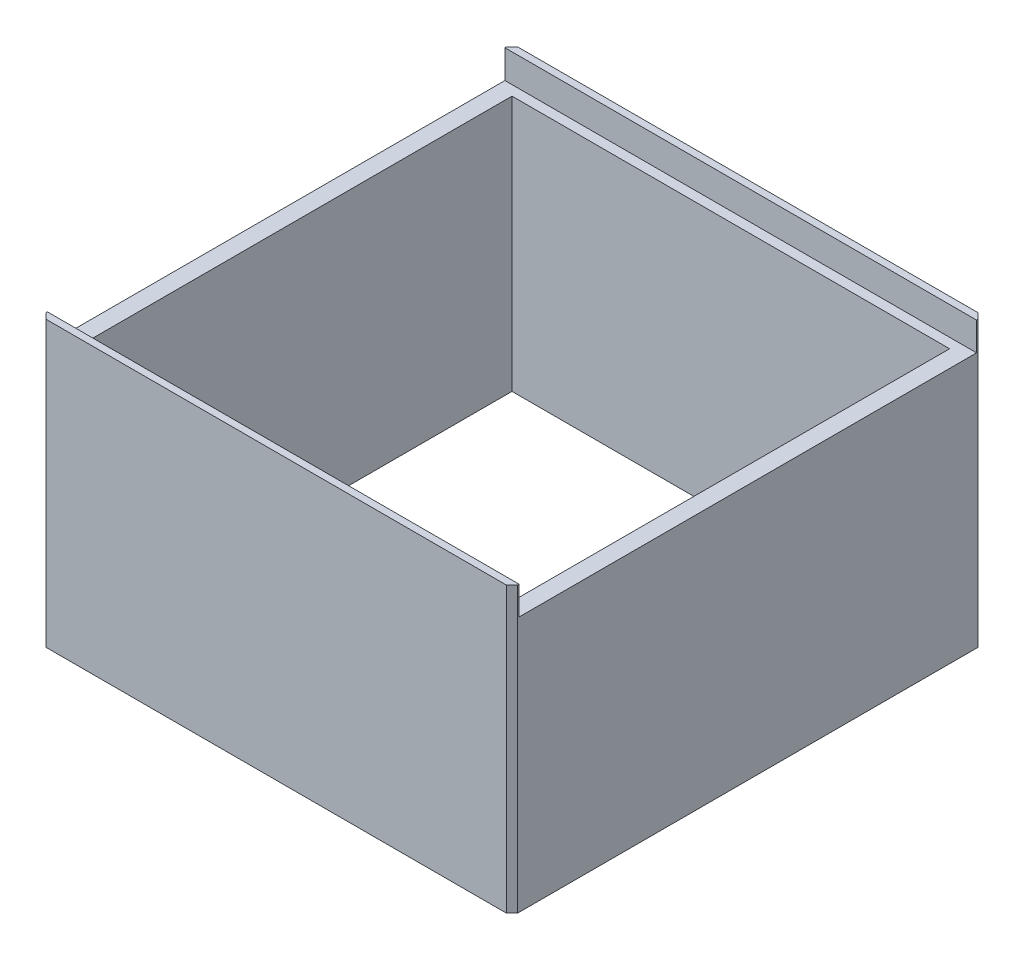
ISO-10303-21;
HEADER;
FILE_DESCRIPTION(('STEP AP214'),'2;1');
FILE_NAME('part.step','',(''),(''),'','','');
FILE_SCHEMA(('AUTOMOTIVE_DESIGN { 1 0 10303 214 1 1 1 1 }'));
ENDSEC;
DATA;
#1=APPLICATION_CONTEXT('core data for automotive mechanical design processes');
#2=APPLICATION_PROTOCOL_DEFINITION('international standard','automotive_design',2000,#1);
#3=PRODUCT_CONTEXT('',#1,'mechanical');
#4=PRODUCT('Part','Part','',(#3));
#5=PRODUCT_RELATED_PRODUCT_CATEGORY('part','',(#4));
#6=PRODUCT_DEFINITION_FORMATION('','',#4);
#7=PRODUCT_DEFINITION_CONTEXT('part definition',#1,'design');
#8=PRODUCT_DEFINITION('design','',#6,#7);
#9=PRODUCT_DEFINITION_SHAPE('','',#8);
#10=(LENGTH_UNIT() NAMED_UNIT(*) SI_UNIT(.MILLI.,.METRE.));
#11=(NAMED_UNIT(*) PLANE_ANGLE_UNIT() SI_UNIT($,.RADIAN.));
#12=(NAMED_UNIT(*) SI_UNIT($,.STERADIAN.) SOLID_ANGLE_UNIT());
#13=UNCERTAINTY_MEASURE_WITH_UNIT(LENGTH_MEASURE(1.E-05),#10,'distance_accuracy_value','');
#14=(GEOMETRIC_REPRESENTATION_CONTEXT(3) GLOBAL_UNCERTAINTY_ASSIGNED_CONTEXT((#13)) GLOBAL_UNIT_ASSIGNED_CONTEXT((#10,
#11,#12)) REPRESENTATION_CONTEXT('',''));
#15=CARTESIAN_POINT('',(0.,0.,0.));
#16=DIRECTION('',(0.,0.,1.));
#17=DIRECTION('',(1.,0.,0.));
#18=AXIS2_PLACEMENT_3D('',#15,#16,#17);
#19=CARTESIAN_POINT('',(38.5,50.,-38.5));
#20=DIRECTION('',(1.,0.,0.));
#21=DIRECTION('',(0.,0.,-1.));
#22=AXIS2_PLACEMENT_3D('',#19,#20,#21);
#23=PLANE('',#22);
#24=DIRECTION('',(0.,0.,1.));
#25=VECTOR('',#24,1.);
#26=CARTESIAN_POINT('',(38.5,4.,-38.5));
#27=LINE('',#26,#25);
#28=CARTESIAN_POINT('',(38.5,4.,-38.5));
#29=VERTEX_POINT('',#28);
#30=CARTESIAN_POINT('',(38.5,4.,-30.5));
#31=VERTEX_POINT('',#30);
#32=EDGE_CURVE('E218',#29,#31,#27,.T.);
#33=ORIENTED_EDGE('',*,*,#32,.T.);
#34=DIRECTION('',(0.,-1.,0.));
#35=VECTOR('',#34,1.);
#36=CARTESIAN_POINT('',(38.5,4.,-30.5));
#37=LINE('',#36,#35);
#38=CARTESIAN_POINT('',(38.5,1.,-30.5));
#39=VERTEX_POINT('',#38);
#40=EDGE_CURVE('E202',#31,#39,#37,.T.);
#41=ORIENTED_EDGE('',*,*,#40,.T.);
#42=DIRECTION('',(0.,0.,1.));
#43=VECTOR('',#42,1.);
#44=CARTESIAN_POINT('',(38.5,1.,-38.5));
#45=LINE('',#44,#43);
#46=CARTESIAN_POINT('',(38.5,1.,-38.5));
#47=VERTEX_POINT('',#46);
#48=EDGE_CURVE('E232',#47,#39,#45,.T.);
#49=ORIENTED_EDGE('',*,*,#48,.F.);
#50=DIRECTION('',(0.,-1.,0.));
#51=VECTOR('',#50,1.);
#52=CARTESIAN_POINT('',(38.5,50.,-38.5));
#53=LINE('',#52,#51);
#54=CARTESIAN_POINT('',(38.5,0.,-38.5));
#55=VERTEX_POINT('',#54);
#56=EDGE_CURVE('E282',#47,#55,#53,.T.);
#57=ORIENTED_EDGE('',*,*,#56,.T.);
#58=DIRECTION('',(0.,0.,1.));
#59=VECTOR('',#58,1.);
#60=CARTESIAN_POINT('',(38.5,0.,-38.5));
#61=LINE('',#60,#59);
#62=CARTESIAN_POINT('',(38.5,0.,38.5));
#63=VERTEX_POINT('',#62);
#64=EDGE_CURVE('E274',#55,#63,#61,.T.);
#65=ORIENTED_EDGE('',*,*,#64,.T.);
#66=DIRECTION('',(0.,-1.,0.));
#67=VECTOR('',#66,1.);
#68=CARTESIAN_POINT('',(38.5,50.,38.5));
#69=LINE('',#68,#67);
#70=CARTESIAN_POINT('',(38.5,45.,38.5));
#71=VERTEX_POINT('',#70);
#72=EDGE_CURVE('E284',#71,#63,#69,.T.);
#73=ORIENTED_EDGE('',*,*,#72,.F.);
#74=DIRECTION('',(0.,0.,1.));
#75=VECTOR('',#74,1.);
#76=CARTESIAN_POINT('',(38.5,45.,-38.5));
#77=LINE('',#76,#75);
#78=CARTESIAN_POINT('',(38.5,45.,-38.5));
#79=VERTEX_POINT('',#78);
#80=EDGE_CURVE('E246',#79,#71,#77,.T.);
#81=ORIENTED_EDGE('',*,*,#80,.F.);
#82=EDGE_CURVE('E225',#79,#29,#53,.T.);
#83=ORIENTED_EDGE('',*,*,#82,.T.);
#84=EDGE_LOOP('',(#33,#41,#49,#57,#65,#73,#81,#83));
#85=FACE_BOUND('',#84,.T.);
#86=ADVANCED_FACE('F63',(#85),#23,.F.);
#87=CARTESIAN_POINT('',(-38.5,50.,-38.5));
#88=DIRECTION('',(0.,0.,-1.));
#89=DIRECTION('',(-1.,0.,0.));
#90=AXIS2_PLACEMENT_3D('',#87,#88,#89);
#91=PLANE('',#90);
#92=DIRECTION('',(1.,0.,0.));
#93=VECTOR('',#92,1.);
#94=CARTESIAN_POINT('',(38.5,4.,-38.5));
#95=LINE('',#94,#93);
#96=CARTESIAN_POINT('',(30.5,4.,-38.5));
#97=VERTEX_POINT('',#96);
#98=EDGE_CURVE('E212',#97,#29,#95,.T.);
#99=ORIENTED_EDGE('',*,*,#98,.T.);
#100=ORIENTED_EDGE('',*,*,#82,.F.);
#101=DIRECTION('',(1.,0.,0.));
#102=VECTOR('',#101,1.);
#103=CARTESIAN_POINT('',(-38.5,45.,-38.5));
#104=LINE('',#103,#102);
#105=CARTESIAN_POINT('',(-38.5,45.,-38.5));
#106=VERTEX_POINT('',#105);
#107=EDGE_CURVE('E301',#106,#79,#104,.T.);
#108=ORIENTED_EDGE('',*,*,#107,.F.);
#109=DIRECTION('',(0.,-1.,0.));
#110=VECTOR('',#109,1.);
#111=CARTESIAN_POINT('',(-38.5,50.,-38.5));
#112=LINE('',#111,#110);
#113=CARTESIAN_POINT('',(-38.5,0.,-38.5));
#114=VERTEX_POINT('',#113);
#115=EDGE_CURVE('E280',#106,#114,#112,.T.);
#116=ORIENTED_EDGE('',*,*,#115,.T.);
#117=DIRECTION('',(1.,0.,0.));
#118=VECTOR('',#117,1.);
#119=CARTESIAN_POINT('',(-38.5,0.,-38.5));
#120=LINE('',#119,#118);
#121=EDGE_CURVE('E277',#114,#55,#120,.T.);
#122=ORIENTED_EDGE('',*,*,#121,.T.);
#123=ORIENTED_EDGE('',*,*,#56,.F.);
#124=DIRECTION('',(1.,0.,0.));
#125=VECTOR('',#124,1.);
#126=CARTESIAN_POINT('',(38.5,1.,-38.5));
#127=LINE('',#126,#125);
#128=CARTESIAN_POINT('',(30.5,1.,-38.5));
#129=VERTEX_POINT('',#128);
#130=EDGE_CURVE('E226',#129,#47,#127,.T.);
#131=ORIENTED_EDGE('',*,*,#130,.F.);
#132=DIRECTION('',(0.,-1.,0.));
#133=VECTOR('',#132,1.);
#134=CARTESIAN_POINT('',(30.5,4.,-38.5));
#135=LINE('',#134,#133);
#136=EDGE_CURVE('E236',#97,#129,#135,.T.);
#137=ORIENTED_EDGE('',*,*,#136,.F.);
#138=EDGE_LOOP('',(#99,#100,#108,#116,#122,#123,#131,#137));
#139=FACE_BOUND('',#138,.T.);
#140=ADVANCED_FACE('F402',(#139),#91,.F.);
#141=CARTESIAN_POINT('',(0.,50.,0.));
#142=DIRECTION('',(0.,1.,0.));
#143=DIRECTION('',(0.,0.,1.));
#144=AXIS2_PLACEMENT_3D('',#141,#142,#143);
#145=PLANE('',#144);
#146=DIRECTION('',(1.,0.,0.));
#147=VECTOR('',#146,1.);
#148=CARTESIAN_POINT('',(-41.5,50.,41.5));
#149=LINE('',#148,#147);
#150=CARTESIAN_POINT('',(-40.5,50.,41.5));
#151=VERTEX_POINT('',#150);
#152=CARTESIAN_POINT('',(40.5,50.,41.5));
#153=VERTEX_POINT('',#152);
#154=EDGE_CURVE('E291',#151,#153,#149,.T.);
#155=ORIENTED_EDGE('',*,*,#154,.T.);
#156=DIRECTION('',(0.70710678118655,0.,-0.707106781186545));
#157=VECTOR('',#156,1.);
#158=CARTESIAN_POINT('',(40.9999999999999,50.,41.0000000000002));
#159=LINE('',#158,#157);
#160=CARTESIAN_POINT('',(41.5,50.,40.5));
#161=VERTEX_POINT('',#160);
#162=EDGE_CURVE('E348',#153,#161,#159,.T.);
#163=ORIENTED_EDGE('',*,*,#162,.T.);
#164=DIRECTION('',(0.,0.,1.));
#165=VECTOR('',#164,1.);
#166=CARTESIAN_POINT('',(41.5,50.,-41.5));
#167=LINE('',#166,#165);
#168=CARTESIAN_POINT('',(41.5,50.,40.25));
#169=VERTEX_POINT('',#168);
#170=EDGE_CURVE('E295',#169,#161,#167,.T.);
#171=ORIENTED_EDGE('',*,*,#170,.F.);
#172=DIRECTION('',(1.,0.,0.));
#173=VECTOR('',#172,1.);
#174=CARTESIAN_POINT('',(-50.25,50.,40.25));
#175=LINE('',#174,#173);
#176=CARTESIAN_POINT('',(-41.5,50.,40.25));
#177=VERTEX_POINT('',#176);
#178=EDGE_CURVE('E244',#177,#169,#175,.T.);
#179=ORIENTED_EDGE('',*,*,#178,.F.);
#180=DIRECTION('',(0.,0.,1.));
#181=VECTOR('',#180,1.);
#182=CARTESIAN_POINT('',(-41.5,50.,-41.5));
#183=LINE('',#182,#181);
#184=CARTESIAN_POINT('',(-41.5,50.,40.5));
#185=VERTEX_POINT('',#184);
#186=EDGE_CURVE('E292',#177,#185,#183,.T.);
#187=ORIENTED_EDGE('',*,*,#186,.T.);
#188=DIRECTION('',(-0.707106781186543,0.,-0.707106781186552));
#189=VECTOR('',#188,1.);
#190=CARTESIAN_POINT('',(-41.0000000000003,50.,40.9999999999997));
#191=LINE('',#190,#189);
#192=EDGE_CURVE('E346',#185,#151,#191,.F.);
#193=ORIENTED_EDGE('',*,*,#192,.T.);
#194=EDGE_LOOP('',(#155,#163,#171,#179,#187,#193));
#195=FACE_BOUND('',#194,.T.);
#196=ADVANCED_FACE('F371',(#195),#145,.T.);
#197=CARTESIAN_POINT('',(-38.5,50.,-38.5));
#198=DIRECTION('',(1.,0.,0.));
#199=DIRECTION('',(0.,0.,-1.));
#200=AXIS2_PLACEMENT_3D('',#197,#198,#199);
#201=PLANE('',#200);
#202=ORIENTED_EDGE('',*,*,#115,.F.);
#203=DIRECTION('',(0.,0.,1.));
#204=VECTOR('',#203,1.);
#205=CARTESIAN_POINT('',(-38.5,45.,-38.5));
#206=LINE('',#205,#204);
#207=CARTESIAN_POINT('',(-38.5,45.,38.5));
#208=VERTEX_POINT('',#207);
#209=EDGE_CURVE('E254',#106,#208,#206,.T.);
#210=ORIENTED_EDGE('',*,*,#209,.T.);
#211=DIRECTION('',(0.,-1.,0.));
#212=VECTOR('',#211,1.);
#213=CARTESIAN_POINT('',(-38.5,50.,38.5));
#214=LINE('',#213,#212);
#215=CARTESIAN_POINT('',(-38.5,0.,38.5));
#216=VERTEX_POINT('',#215);
#217=EDGE_CURVE('E286',#208,#216,#214,.T.);
#218=ORIENTED_EDGE('',*,*,#217,.T.);
#219=DIRECTION('',(0.,0.,1.));
#220=VECTOR('',#219,1.);
#221=CARTESIAN_POINT('',(-38.5,0.,-38.5));
#222=LINE('',#221,#220);
#223=EDGE_CURVE('E268',#114,#216,#222,.T.);
#224=ORIENTED_EDGE('',*,*,#223,.F.);
#225=EDGE_LOOP('',(#202,#210,#218,#224));
#226=FACE_BOUND('',#225,.T.);
#227=ADVANCED_FACE('F414',(#226),#201,.T.);
#228=CARTESIAN_POINT('',(-38.5,50.,38.5));
#229=DIRECTION('',(0.,0.,-1.));
#230=DIRECTION('',(-1.,0.,0.));
#231=AXIS2_PLACEMENT_3D('',#228,#229,#230);
#232=PLANE('',#231);
#233=ORIENTED_EDGE('',*,*,#217,.F.);
#234=DIRECTION('',(1.,0.,0.));
#235=VECTOR('',#234,1.);
#236=CARTESIAN_POINT('',(-38.5,45.,38.5));
#237=LINE('',#236,#235);
#238=EDGE_CURVE('E251',#208,#71,#237,.T.);
#239=ORIENTED_EDGE('',*,*,#238,.T.);
#240=ORIENTED_EDGE('',*,*,#72,.T.);
#241=DIRECTION('',(1.,0.,0.));
#242=VECTOR('',#241,1.);
#243=CARTESIAN_POINT('',(-38.5,0.,38.5));
#244=LINE('',#243,#242);
#245=EDGE_CURVE('E271',#216,#63,#244,.T.);
#246=ORIENTED_EDGE('',*,*,#245,.F.);
#247=EDGE_LOOP('',(#233,#239,#240,#246));
#248=FACE_BOUND('',#247,.T.);
#249=ADVANCED_FACE('F411',(#248),#232,.T.);
#250=CARTESIAN_POINT('',(41.5,50.,-40.5));
#251=VERTEX_POINT('',#250);
#252=CARTESIAN_POINT('',(41.5,50.,-40.25));
#253=VERTEX_POINT('',#252);
#254=EDGE_CURVE('E296',#251,#253,#167,.T.);
#255=ORIENTED_EDGE('',*,*,#254,.F.);
#256=DIRECTION('',(0.707106781186545,0.,0.70710678118655));
#257=VECTOR('',#256,1.);
#258=CARTESIAN_POINT('',(41.0000000000001,50.,-40.9999999999999));
#259=LINE('',#258,#257);
#260=CARTESIAN_POINT('',(40.5,50.,-41.5));
#261=VERTEX_POINT('',#260);
#262=EDGE_CURVE('E339',#251,#261,#259,.F.);
#263=ORIENTED_EDGE('',*,*,#262,.T.);
#264=DIRECTION('',(1.,0.,0.));
#265=VECTOR('',#264,1.);
#266=CARTESIAN_POINT('',(-41.5,50.,-41.5));
#267=LINE('',#266,#265);
#268=CARTESIAN_POINT('',(-40.5,50.,-41.5));
#269=VERTEX_POINT('',#268);
#270=EDGE_CURVE('E298',#269,#261,#267,.T.);
#271=ORIENTED_EDGE('',*,*,#270,.F.);
#272=DIRECTION('',(-0.707106781186552,0.,0.707106781186543));
#273=VECTOR('',#272,1.);
#274=CARTESIAN_POINT('',(-40.9999999999997,50.,-41.0000000000003));
#275=LINE('',#274,#273);
#276=CARTESIAN_POINT('',(-41.5,50.,-40.5));
#277=VERTEX_POINT('',#276);
#278=EDGE_CURVE('E337',#269,#277,#275,.T.);
#279=ORIENTED_EDGE('',*,*,#278,.T.);
#280=CARTESIAN_POINT('',(-41.5,50.,-40.25));
#281=VERTEX_POINT('',#280);
#282=EDGE_CURVE('E289',#277,#281,#183,.T.);
#283=ORIENTED_EDGE('',*,*,#282,.T.);
#284=DIRECTION('',(-1.,0.,0.));
#285=VECTOR('',#284,1.);
#286=CARTESIAN_POINT('',(-50.25,50.,-40.25));
#287=LINE('',#286,#285);
#288=EDGE_CURVE('E238',#253,#281,#287,.T.);
#289=ORIENTED_EDGE('',*,*,#288,.F.);
#290=EDGE_LOOP('',(#255,#263,#271,#279,#283,#289));
#291=FACE_BOUND('',#290,.T.);
#292=ADVANCED_FACE('F392',(#291),#145,.T.);
#293=CARTESIAN_POINT('',(0.,0.,0.));
#294=DIRECTION('',(0.,1.,0.));
#295=DIRECTION('',(0.,0.,1.));
#296=AXIS2_PLACEMENT_3D('',#293,#294,#295);
#297=PLANE('',#296);
#298=DIRECTION('',(1.,0.,0.));
#299=VECTOR('',#298,1.);
#300=CARTESIAN_POINT('',(-41.5,0.,-41.5));
#301=LINE('',#300,#299);
#302=CARTESIAN_POINT('',(-40.5,0.,-41.5));
#303=VERTEX_POINT('',#302);
#304=CARTESIAN_POINT('',(40.5,0.,-41.5));
#305=VERTEX_POINT('',#304);
#306=EDGE_CURVE('E309',#303,#305,#301,.T.);
#307=ORIENTED_EDGE('',*,*,#306,.T.);
#308=DIRECTION('',(-0.707106781186545,0.,-0.70710678118655));
#309=VECTOR('',#308,1.);
#310=CARTESIAN_POINT('',(40.5,0.,-41.5));
#311=LINE('',#310,#309);
#312=CARTESIAN_POINT('',(41.5,0.,-40.5));
#313=VERTEX_POINT('',#312);
#314=EDGE_CURVE('E330',#305,#313,#311,.F.);
#315=ORIENTED_EDGE('',*,*,#314,.T.);
#316=DIRECTION('',(0.,0.,1.));
#317=VECTOR('',#316,1.);
#318=CARTESIAN_POINT('',(41.5,0.,-41.5));
#319=LINE('',#318,#317);
#320=CARTESIAN_POINT('',(41.5,0.,40.5));
#321=VERTEX_POINT('',#320);
#322=EDGE_CURVE('E306',#313,#321,#319,.T.);
#323=ORIENTED_EDGE('',*,*,#322,.T.);
#324=DIRECTION('',(-0.70710678118655,0.,0.707106781186545));
#325=VECTOR('',#324,1.);
#326=CARTESIAN_POINT('',(41.5,0.,40.5));
#327=LINE('',#326,#325);
#328=CARTESIAN_POINT('',(40.5,0.,41.5));
#329=VERTEX_POINT('',#328);
#330=EDGE_CURVE('E328',#321,#329,#327,.T.);
#331=ORIENTED_EDGE('',*,*,#330,.T.);
#332=DIRECTION('',(1.,0.,0.));
#333=VECTOR('',#332,1.);
#334=CARTESIAN_POINT('',(-41.5,0.,41.5));
#335=LINE('',#334,#333);
#336=CARTESIAN_POINT('',(-40.5,0.,41.5));
#337=VERTEX_POINT('',#336);
#338=EDGE_CURVE('E303',#337,#329,#335,.T.);
#339=ORIENTED_EDGE('',*,*,#338,.F.);
#340=DIRECTION('',(0.707106781186543,0.,0.707106781186552));
#341=VECTOR('',#340,1.);
#342=CARTESIAN_POINT('',(-40.5,0.,41.5));
#343=LINE('',#342,#341);
#344=CARTESIAN_POINT('',(-41.5,0.,40.5));
#345=VERTEX_POINT('',#344);
#346=EDGE_CURVE('E326',#337,#345,#343,.F.);
#347=ORIENTED_EDGE('',*,*,#346,.T.);
#348=DIRECTION('',(0.,0.,1.));
#349=VECTOR('',#348,1.);
#350=CARTESIAN_POINT('',(-41.5,0.,-41.5));
#351=LINE('',#350,#349);
#352=CARTESIAN_POINT('',(-41.5,0.,-40.5));
#353=VERTEX_POINT('',#352);
#354=EDGE_CURVE('E288',#353,#345,#351,.T.);
#355=ORIENTED_EDGE('',*,*,#354,.F.);
#356=DIRECTION('',(0.707106781186552,0.,-0.707106781186543));
#357=VECTOR('',#356,1.);
#358=CARTESIAN_POINT('',(-41.5,0.,-40.5));
#359=LINE('',#358,#357);
#360=EDGE_CURVE('E324',#353,#303,#359,.T.);
#361=ORIENTED_EDGE('',*,*,#360,.T.);
#362=EDGE_LOOP('',(#307,#315,#323,#331,#339,#347,#355,#361));
#363=FACE_BOUND('',#362,.T.);
#364=ORIENTED_EDGE('',*,*,#223,.T.);
#365=ORIENTED_EDGE('',*,*,#245,.T.);
#366=ORIENTED_EDGE('',*,*,#64,.F.);
#367=ORIENTED_EDGE('',*,*,#121,.F.);
#368=EDGE_LOOP('',(#364,#365,#366,#367));
#369=FACE_BOUND('',#368,.T.);
#370=ADVANCED_FACE('F357',(#363,#369),#297,.F.);
#371=CARTESIAN_POINT('',(-41.5,50.,-41.5));
#372=DIRECTION('',(1.,0.,0.));
#373=DIRECTION('',(0.,0.,-1.));
#374=AXIS2_PLACEMENT_3D('',#371,#372,#373);
#375=PLANE('',#374);
#376=ORIENTED_EDGE('',*,*,#354,.T.);
#377=DIRECTION('',(0.,1.,0.));
#378=VECTOR('',#377,1.);
#379=CARTESIAN_POINT('',(-41.5,50.,40.5));
#380=LINE('',#379,#378);
#381=EDGE_CURVE('E12',#345,#185,#380,.T.);
#382=ORIENTED_EDGE('',*,*,#381,.T.);
#383=ORIENTED_EDGE('',*,*,#186,.F.);
#384=DIRECTION('',(0.,-1.,0.));
#385=VECTOR('',#384,1.);
#386=CARTESIAN_POINT('',(-41.5,50.,40.25));
#387=LINE('',#386,#385);
#388=CARTESIAN_POINT('',(-41.5,45.,40.25));
#389=VERTEX_POINT('',#388);
#390=EDGE_CURVE('E265',#177,#389,#387,.T.);
#391=ORIENTED_EDGE('',*,*,#390,.T.);
#392=DIRECTION('',(0.,0.,1.));
#393=VECTOR('',#392,1.);
#394=CARTESIAN_POINT('',(-41.5,45.,-41.5));
#395=LINE('',#394,#393);
#396=CARTESIAN_POINT('',(-41.5,45.,-40.25));
#397=VERTEX_POINT('',#396);
#398=EDGE_CURVE('E260',#397,#389,#395,.T.);
#399=ORIENTED_EDGE('',*,*,#398,.F.);
#400=DIRECTION('',(0.,1.,0.));
#401=VECTOR('',#400,1.);
#402=CARTESIAN_POINT('',(-41.5,50.,-40.25));
#403=LINE('',#402,#401);
#404=EDGE_CURVE('E262',#397,#281,#403,.T.);
#405=ORIENTED_EDGE('',*,*,#404,.T.);
#406=ORIENTED_EDGE('',*,*,#282,.F.);
#407=DIRECTION('',(0.,-1.,0.));
#408=VECTOR('',#407,1.);
#409=CARTESIAN_POINT('',(-41.5,0.,-40.5));
#410=LINE('',#409,#408);
#411=EDGE_CURVE('E72',#277,#353,#410,.T.);
#412=ORIENTED_EDGE('',*,*,#411,.T.);
#413=EDGE_LOOP('',(#376,#382,#383,#391,#399,#405,#406,#412));
#414=FACE_BOUND('',#413,.T.);
#415=ADVANCED_FACE('F353',(#414),#375,.F.);
#416=CARTESIAN_POINT('',(-41.5,50.,41.5));
#417=DIRECTION('',(0.,0.,-1.));
#418=DIRECTION('',(-1.,0.,0.));
#419=AXIS2_PLACEMENT_3D('',#416,#417,#418);
#420=PLANE('',#419);
#421=ORIENTED_EDGE('',*,*,#338,.T.);
#422=DIRECTION('',(0.,1.,0.));
#423=VECTOR('',#422,1.);
#424=CARTESIAN_POINT('',(40.5,50.,41.5));
#425=LINE('',#424,#423);
#426=EDGE_CURVE('E344',#329,#153,#425,.T.);
#427=ORIENTED_EDGE('',*,*,#426,.T.);
#428=ORIENTED_EDGE('',*,*,#154,.F.);
#429=DIRECTION('',(0.,-1.,0.));
#430=VECTOR('',#429,1.);
#431=CARTESIAN_POINT('',(-40.5,50.,41.5));
#432=LINE('',#431,#430);
#433=EDGE_CURVE('E341',#151,#337,#432,.T.);
#434=ORIENTED_EDGE('',*,*,#433,.T.);
#435=EDGE_LOOP('',(#421,#427,#428,#434));
#436=FACE_BOUND('',#435,.T.);
#437=ADVANCED_FACE('F367',(#436),#420,.F.);
#438=CARTESIAN_POINT('',(41.5,50.,-41.5));
#439=DIRECTION('',(1.,0.,0.));
#440=DIRECTION('',(0.,0.,-1.));
#441=AXIS2_PLACEMENT_3D('',#438,#439,#440);
#442=PLANE('',#441);
#443=ORIENTED_EDGE('',*,*,#322,.F.);
#444=DIRECTION('',(0.,1.,0.));
#445=VECTOR('',#444,1.);
#446=CARTESIAN_POINT('',(41.5,50.,-40.5));
#447=LINE('',#446,#445);
#448=EDGE_CURVE('E335',#313,#251,#447,.T.);
#449=ORIENTED_EDGE('',*,*,#448,.T.);
#450=ORIENTED_EDGE('',*,*,#254,.T.);
#451=DIRECTION('',(0.,1.,0.));
#452=VECTOR('',#451,1.);
#453=CARTESIAN_POINT('',(41.5,50.,-40.25));
#454=LINE('',#453,#452);
#455=CARTESIAN_POINT('',(41.5,45.,-40.25));
#456=VERTEX_POINT('',#455);
#457=EDGE_CURVE('E313',#456,#253,#454,.T.);
#458=ORIENTED_EDGE('',*,*,#457,.F.);
#459=DIRECTION('',(0.,0.,1.));
#460=VECTOR('',#459,1.);
#461=CARTESIAN_POINT('',(41.5,45.,-41.5));
#462=LINE('',#461,#460);
#463=CARTESIAN_POINT('',(41.5,45.,40.25));
#464=VERTEX_POINT('',#463);
#465=EDGE_CURVE('E257',#456,#464,#462,.T.);
#466=ORIENTED_EDGE('',*,*,#465,.T.);
#467=DIRECTION('',(0.,-1.,0.));
#468=VECTOR('',#467,1.);
#469=CARTESIAN_POINT('',(41.5,50.,40.25));
#470=LINE('',#469,#468);
#471=EDGE_CURVE('E316',#169,#464,#470,.T.);
#472=ORIENTED_EDGE('',*,*,#471,.F.);
#473=ORIENTED_EDGE('',*,*,#170,.T.);
#474=DIRECTION('',(0.,-1.,0.));
#475=VECTOR('',#474,1.);
#476=CARTESIAN_POINT('',(41.5,0.,40.5));
#477=LINE('',#476,#475);
#478=EDGE_CURVE('E332',#161,#321,#477,.T.);
#479=ORIENTED_EDGE('',*,*,#478,.T.);
#480=EDGE_LOOP('',(#443,#449,#450,#458,#466,#472,#473,#479));
#481=FACE_BOUND('',#480,.T.);
#482=ADVANCED_FACE('F379',(#481),#442,.T.);
#483=CARTESIAN_POINT('',(-41.5,50.,-41.5));
#484=DIRECTION('',(0.,0.,-1.));
#485=DIRECTION('',(-1.,0.,0.));
#486=AXIS2_PLACEMENT_3D('',#483,#484,#485);
#487=PLANE('',#486);
#488=ORIENTED_EDGE('',*,*,#270,.T.);
#489=DIRECTION('',(0.,-1.,0.));
#490=VECTOR('',#489,1.);
#491=CARTESIAN_POINT('',(40.5,50.,-41.5));
#492=LINE('',#491,#490);
#493=EDGE_CURVE('E321',#261,#305,#492,.T.);
#494=ORIENTED_EDGE('',*,*,#493,.T.);
#495=ORIENTED_EDGE('',*,*,#306,.F.);
#496=DIRECTION('',(0.,1.,0.));
#497=VECTOR('',#496,1.);
#498=CARTESIAN_POINT('',(-40.5,50.,-41.5));
#499=LINE('',#498,#497);
#500=EDGE_CURVE('E319',#303,#269,#499,.T.);
#501=ORIENTED_EDGE('',*,*,#500,.T.);
#502=EDGE_LOOP('',(#488,#494,#495,#501));
#503=FACE_BOUND('',#502,.T.);
#504=ADVANCED_FACE('F387',(#503),#487,.T.);
#505=CARTESIAN_POINT('',(-50.25,45.,40.25));
#506=DIRECTION('',(0.,0.,1.));
#507=DIRECTION('',(1.,0.,0.));
#508=AXIS2_PLACEMENT_3D('',#505,#506,#507);
#509=PLANE('',#508);
#510=ORIENTED_EDGE('',*,*,#178,.T.);
#511=ORIENTED_EDGE('',*,*,#471,.T.);
#512=DIRECTION('',(1.,0.,0.));
#513=VECTOR('',#512,1.);
#514=CARTESIAN_POINT('',(-50.25,45.,40.25));
#515=LINE('',#514,#513);
#516=EDGE_CURVE('E243',#389,#464,#515,.T.);
#517=ORIENTED_EDGE('',*,*,#516,.F.);
#518=ORIENTED_EDGE('',*,*,#390,.F.);
#519=EDGE_LOOP('',(#510,#511,#517,#518));
#520=FACE_BOUND('',#519,.T.);
#521=ADVANCED_FACE('F425',(#520),#509,.F.);
#522=CARTESIAN_POINT('',(-50.25,45.,-40.25));
#523=DIRECTION('',(0.,0.,-1.));
#524=DIRECTION('',(-1.,0.,0.));
#525=AXIS2_PLACEMENT_3D('',#522,#523,#524);
#526=PLANE('',#525);
#527=DIRECTION('',(-1.,0.,0.));
#528=VECTOR('',#527,1.);
#529=CARTESIAN_POINT('',(-50.25,45.,-40.25));
#530=LINE('',#529,#528);
#531=EDGE_CURVE('E240',#456,#397,#530,.T.);
#532=ORIENTED_EDGE('',*,*,#531,.F.);
#533=ORIENTED_EDGE('',*,*,#457,.T.);
#534=ORIENTED_EDGE('',*,*,#288,.T.);
#535=ORIENTED_EDGE('',*,*,#404,.F.);
#536=EDGE_LOOP('',(#532,#533,#534,#535));
#537=FACE_BOUND('',#536,.T.);
#538=ADVANCED_FACE('F508',(#537),#526,.F.);
#539=CARTESIAN_POINT('',(0.,45.,0.));
#540=DIRECTION('',(0.,1.,0.));
#541=DIRECTION('',(0.,0.,1.));
#542=AXIS2_PLACEMENT_3D('',#539,#540,#541);
#543=PLANE('',#542);
#544=ORIENTED_EDGE('',*,*,#107,.T.);
#545=ORIENTED_EDGE('',*,*,#80,.T.);
#546=ORIENTED_EDGE('',*,*,#238,.F.);
#547=ORIENTED_EDGE('',*,*,#209,.F.);
#548=EDGE_LOOP('',(#544,#545,#546,#547));
#549=FACE_BOUND('',#548,.T.);
#550=ORIENTED_EDGE('',*,*,#398,.T.);
#551=ORIENTED_EDGE('',*,*,#516,.T.);
#552=ORIENTED_EDGE('',*,*,#465,.F.);
#553=ORIENTED_EDGE('',*,*,#531,.T.);
#554=EDGE_LOOP('',(#550,#551,#552,#553));
#555=FACE_BOUND('',#554,.T.);
#556=ADVANCED_FACE('F438',(#549,#555),#543,.T.);
#557=CARTESIAN_POINT('',(40.5,50.,-41.5));
#558=DIRECTION('',(-0.70710678118655,0.,0.707106781186545));
#559=DIRECTION('',(0.,-1.,0.));
#560=AXIS2_PLACEMENT_3D('',#557,#558,#559);
#561=PLANE('',#560);
#562=ORIENTED_EDGE('',*,*,#262,.F.);
#563=ORIENTED_EDGE('',*,*,#448,.F.);
#564=ORIENTED_EDGE('',*,*,#314,.F.);
#565=ORIENTED_EDGE('',*,*,#493,.F.);
#566=EDGE_LOOP('',(#562,#563,#564,#565));
#567=FACE_BOUND('',#566,.T.);
#568=ADVANCED_FACE('F385',(#567),#561,.F.);
#569=CARTESIAN_POINT('',(41.5,50.,40.5));
#570=DIRECTION('',(0.707106781186545,0.,0.70710678118655));
#571=DIRECTION('',(0.,1.,0.));
#572=AXIS2_PLACEMENT_3D('',#569,#570,#571);
#573=PLANE('',#572);
#574=ORIENTED_EDGE('',*,*,#162,.F.);
#575=ORIENTED_EDGE('',*,*,#426,.F.);
#576=ORIENTED_EDGE('',*,*,#330,.F.);
#577=ORIENTED_EDGE('',*,*,#478,.F.);
#578=EDGE_LOOP('',(#574,#575,#576,#577));
#579=FACE_BOUND('',#578,.T.);
#580=ADVANCED_FACE('F376',(#579),#573,.T.);
#581=CARTESIAN_POINT('',(-40.5,50.,41.5));
#582=DIRECTION('',(0.707106781186552,0.,-0.707106781186543));
#583=DIRECTION('',(0.,-1.,0.));
#584=AXIS2_PLACEMENT_3D('',#581,#582,#583);
#585=PLANE('',#584);
#586=ORIENTED_EDGE('',*,*,#192,.F.);
#587=ORIENTED_EDGE('',*,*,#381,.F.);
#588=ORIENTED_EDGE('',*,*,#346,.F.);
#589=ORIENTED_EDGE('',*,*,#433,.F.);
#590=EDGE_LOOP('',(#586,#587,#588,#589));
#591=FACE_BOUND('',#590,.T.);
#592=ADVANCED_FACE('F364',(#591),#585,.F.);
#593=CARTESIAN_POINT('',(-41.5,50.,-40.5));
#594=DIRECTION('',(-0.707106781186543,0.,-0.707106781186552));
#595=DIRECTION('',(0.,1.,0.));
#596=AXIS2_PLACEMENT_3D('',#593,#594,#595);
#597=PLANE('',#596);
#598=ORIENTED_EDGE('',*,*,#278,.F.);
#599=ORIENTED_EDGE('',*,*,#500,.F.);
#600=ORIENTED_EDGE('',*,*,#360,.F.);
#601=ORIENTED_EDGE('',*,*,#411,.F.);
#602=EDGE_LOOP('',(#598,#599,#600,#601));
#603=FACE_BOUND('',#602,.T.);
#604=ADVANCED_FACE('F66',(#603),#597,.T.);
#605=CARTESIAN_POINT('',(30.5,4.,-38.5));
#606=DIRECTION('',(-1.,0.,0.));
#607=DIRECTION('',(0.,0.,1.));
#608=AXIS2_PLACEMENT_3D('',#605,#606,#607);
#609=PLANE('',#608);
#610=DIRECTION('',(0.,0.,-1.));
#611=VECTOR('',#610,1.);
#612=CARTESIAN_POINT('',(30.5,1.,-38.5));
#613=LINE('',#612,#611);
#614=CARTESIAN_POINT('',(30.5,1.,-30.5));
#615=VERTEX_POINT('',#614);
#616=EDGE_CURVE('E79',#615,#129,#613,.T.);
#617=ORIENTED_EDGE('',*,*,#616,.F.);
#618=DIRECTION('',(0.,-1.,0.));
#619=VECTOR('',#618,1.);
#620=CARTESIAN_POINT('',(30.5,4.,-30.5));
#621=LINE('',#620,#619);
#622=CARTESIAN_POINT('',(30.5,4.,-30.5));
#623=VERTEX_POINT('',#622);
#624=EDGE_CURVE('E211',#623,#615,#621,.T.);
#625=ORIENTED_EDGE('',*,*,#624,.F.);
#626=DIRECTION('',(0.,0.,-1.));
#627=VECTOR('',#626,1.);
#628=CARTESIAN_POINT('',(30.5,4.,-38.5));
#629=LINE('',#628,#627);
#630=EDGE_CURVE('E220',#623,#97,#629,.T.);
#631=ORIENTED_EDGE('',*,*,#630,.T.);
#632=ORIENTED_EDGE('',*,*,#136,.T.);
#633=EDGE_LOOP('',(#617,#625,#631,#632));
#634=FACE_BOUND('',#633,.T.);
#635=ADVANCED_FACE('F394',(#634),#609,.T.);
#636=CARTESIAN_POINT('',(38.5,4.,-30.5));
#637=DIRECTION('',(0.,0.,1.));
#638=DIRECTION('',(1.,0.,0.));
#639=AXIS2_PLACEMENT_3D('',#636,#637,#638);
#640=PLANE('',#639);
#641=DIRECTION('',(-1.,0.,0.));
#642=VECTOR('',#641,1.);
#643=CARTESIAN_POINT('',(38.5,1.,-30.5));
#644=LINE('',#643,#642);
#645=EDGE_CURVE('E206',#39,#615,#644,.T.);
#646=ORIENTED_EDGE('',*,*,#645,.F.);
#647=ORIENTED_EDGE('',*,*,#40,.F.);
#648=DIRECTION('',(-1.,0.,0.));
#649=VECTOR('',#648,1.);
#650=CARTESIAN_POINT('',(38.5,4.,-30.5));
#651=LINE('',#650,#649);
#652=EDGE_CURVE('E205',#31,#623,#651,.T.);
#653=ORIENTED_EDGE('',*,*,#652,.T.);
#654=ORIENTED_EDGE('',*,*,#624,.T.);
#655=EDGE_LOOP('',(#646,#647,#653,#654));
#656=FACE_BOUND('',#655,.T.);
#657=ADVANCED_FACE('F204',(#656),#640,.T.);
#658=CARTESIAN_POINT('',(0.,4.,0.));
#659=DIRECTION('',(0.,-1.,0.));
#660=DIRECTION('',(0.,0.,-1.));
#661=AXIS2_PLACEMENT_3D('',#658,#659,#660);
#662=PLANE('',#661);
#663=ORIENTED_EDGE('',*,*,#32,.F.);
#664=ORIENTED_EDGE('',*,*,#98,.F.);
#665=ORIENTED_EDGE('',*,*,#630,.F.);
#666=ORIENTED_EDGE('',*,*,#652,.F.);
#667=EDGE_LOOP('',(#663,#664,#665,#666));
#668=FACE_BOUND('',#667,.T.);
#669=ADVANCED_FACE('F216',(#668),#662,.F.);
#670=CARTESIAN_POINT('',(0.,1.,0.));
#671=DIRECTION('',(0.,-1.,0.));
#672=DIRECTION('',(0.,0.,-1.));
#673=AXIS2_PLACEMENT_3D('',#670,#671,#672);
#674=PLANE('',#673);
#675=ORIENTED_EDGE('',*,*,#48,.T.);
#676=ORIENTED_EDGE('',*,*,#645,.T.);
#677=ORIENTED_EDGE('',*,*,#616,.T.);
#678=ORIENTED_EDGE('',*,*,#130,.T.);
#679=EDGE_LOOP('',(#675,#676,#677,#678));
#680=FACE_BOUND('',#679,.T.);
#681=ADVANCED_FACE('F494',(#680),#674,.T.);
#682=CLOSED_SHELL('',(#86,#140,#196,#227,#249,#292,#370,#415,#437,#482,#504,#521,#538,#556,#568,
#580,#592,#604,#635,#657,#669,#681));
#683=MANIFOLD_SOLID_BREP('B2',#682);
#684=ADVANCED_BREP_SHAPE_REPRESENTATION('',(#18,#683),#14);
#685=SHAPE_DEFINITION_REPRESENTATION(#9,#684);
ENDSEC;
END-ISO-10303-21;
